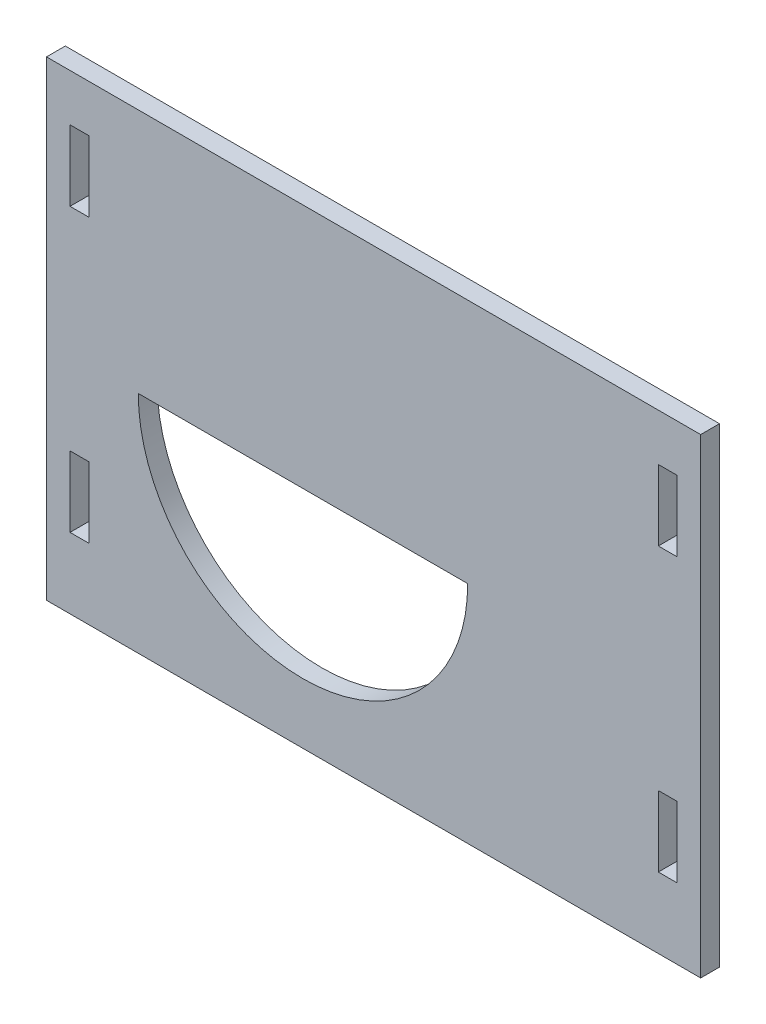
ISO-10303-21;
HEADER;
FILE_DESCRIPTION(('STEP AP214'),'2;1');
FILE_NAME('part.step','',(''),(''),'','','');
FILE_SCHEMA(('AUTOMOTIVE_DESIGN { 1 0 10303 214 1 1 1 1 }'));
ENDSEC;
DATA;
#1=APPLICATION_CONTEXT('core data for automotive mechanical design processes');
#2=APPLICATION_PROTOCOL_DEFINITION('international standard','automotive_design',2000,#1);
#3=PRODUCT_CONTEXT('',#1,'mechanical');
#4=PRODUCT('Part','Part','',(#3));
#5=PRODUCT_RELATED_PRODUCT_CATEGORY('part','',(#4));
#6=PRODUCT_DEFINITION_FORMATION('','',#4);
#7=PRODUCT_DEFINITION_CONTEXT('part definition',#1,'design');
#8=PRODUCT_DEFINITION('design','',#6,#7);
#9=PRODUCT_DEFINITION_SHAPE('','',#8);
#10=(LENGTH_UNIT() NAMED_UNIT(*) SI_UNIT(.MILLI.,.METRE.));
#11=(NAMED_UNIT(*) PLANE_ANGLE_UNIT() SI_UNIT($,.RADIAN.));
#12=(NAMED_UNIT(*) SI_UNIT($,.STERADIAN.) SOLID_ANGLE_UNIT());
#13=UNCERTAINTY_MEASURE_WITH_UNIT(LENGTH_MEASURE(1.E-05),#10,'distance_accuracy_value','');
#14=(GEOMETRIC_REPRESENTATION_CONTEXT(3) GLOBAL_UNCERTAINTY_ASSIGNED_CONTEXT((#13)) GLOBAL_UNIT_ASSIGNED_CONTEXT((#10,
#11,#12)) REPRESENTATION_CONTEXT('',''));
#15=CARTESIAN_POINT('',(0.,0.,0.));
#16=DIRECTION('',(0.,0.,1.));
#17=DIRECTION('',(1.,0.,0.));
#18=AXIS2_PLACEMENT_3D('',#15,#16,#17);
#19=CARTESIAN_POINT('',(0.,0.,4.));
#20=DIRECTION('',(0.,0.,-1.));
#21=DIRECTION('',(-1.,0.,0.));
#22=AXIS2_PLACEMENT_3D('',#19,#20,#21);
#23=PLANE('',#22);
#24=DIRECTION('',(0.,1.,0.));
#25=VECTOR('',#24,1.);
#26=CARTESIAN_POINT('',(79.5,37.5,4.));
#27=LINE('',#26,#25);
#28=CARTESIAN_POINT('',(79.5,22.5000000000001,4.));
#29=VERTEX_POINT('',#28);
#30=CARTESIAN_POINT('',(79.5,37.5,4.));
#31=VERTEX_POINT('',#30);
#32=EDGE_CURVE('E218',#29,#31,#27,.T.);
#33=ORIENTED_EDGE('',*,*,#32,.F.);
#34=DIRECTION('',(1.,0.,0.));
#35=VECTOR('',#34,1.);
#36=CARTESIAN_POINT('',(79.5,22.5000000000001,4.));
#37=LINE('',#36,#35);
#38=CARTESIAN_POINT('',(75.5,22.5000000000001,4.));
#39=VERTEX_POINT('',#38);
#40=EDGE_CURVE('E226',#39,#29,#37,.T.);
#41=ORIENTED_EDGE('',*,*,#40,.F.);
#42=DIRECTION('',(0.,-1.,0.));
#43=VECTOR('',#42,1.);
#44=CARTESIAN_POINT('',(75.5,37.5,4.));
#45=LINE('',#44,#43);
#46=CARTESIAN_POINT('',(75.5,37.5,4.));
#47=VERTEX_POINT('',#46);
#48=EDGE_CURVE('E223',#47,#39,#45,.T.);
#49=ORIENTED_EDGE('',*,*,#48,.F.);
#50=DIRECTION('',(-1.,0.,0.));
#51=VECTOR('',#50,1.);
#52=CARTESIAN_POINT('',(79.5,37.5,4.));
#53=LINE('',#52,#51);
#54=EDGE_CURVE('E220',#31,#47,#53,.T.);
#55=ORIENTED_EDGE('',*,*,#54,.F.);
#56=EDGE_LOOP('',(#33,#41,#49,#55));
#57=FACE_BOUND('',#56,.T.);
#58=DIRECTION('',(1.,0.,0.));
#59=VECTOR('',#58,1.);
#60=CARTESIAN_POINT('',(-45.5,-37.5,4.));
#61=LINE('',#60,#59);
#62=CARTESIAN_POINT('',(-49.5,-37.5,4.));
#63=VERTEX_POINT('',#62);
#64=CARTESIAN_POINT('',(-45.5,-37.5,4.));
#65=VERTEX_POINT('',#64);
#66=EDGE_CURVE('E280',#63,#65,#61,.T.);
#67=ORIENTED_EDGE('',*,*,#66,.F.);
#68=DIRECTION('',(0.,-1.,0.));
#69=VECTOR('',#68,1.);
#70=CARTESIAN_POINT('',(-49.5,-37.5,4.));
#71=LINE('',#70,#69);
#72=CARTESIAN_POINT('',(-49.5,-22.5000000000001,4.));
#73=VERTEX_POINT('',#72);
#74=EDGE_CURVE('E288',#73,#63,#71,.T.);
#75=ORIENTED_EDGE('',*,*,#74,.F.);
#76=DIRECTION('',(-1.,0.,0.));
#77=VECTOR('',#76,1.);
#78=CARTESIAN_POINT('',(-45.5,-22.5,4.));
#79=LINE('',#78,#77);
#80=CARTESIAN_POINT('',(-45.5,-22.5,4.));
#81=VERTEX_POINT('',#80);
#82=EDGE_CURVE('E285',#81,#73,#79,.T.);
#83=ORIENTED_EDGE('',*,*,#82,.F.);
#84=DIRECTION('',(0.,1.,0.));
#85=VECTOR('',#84,1.);
#86=CARTESIAN_POINT('',(-45.5,-37.5,4.));
#87=LINE('',#86,#85);
#88=EDGE_CURVE('E282',#65,#81,#87,.T.);
#89=ORIENTED_EDGE('',*,*,#88,.F.);
#90=EDGE_LOOP('',(#67,#75,#83,#89));
#91=FACE_BOUND('',#90,.T.);
#92=DIRECTION('',(-1.,0.,0.));
#93=VECTOR('',#92,1.);
#94=CARTESIAN_POINT('',(64.5,47.5,4.));
#95=LINE('',#94,#93);
#96=CARTESIAN_POINT('',(84.5,47.5,4.));
#97=VERTEX_POINT('',#96);
#98=CARTESIAN_POINT('',(-54.5,47.5,4.));
#99=VERTEX_POINT('',#98);
#100=EDGE_CURVE('E328',#97,#99,#95,.T.);
#101=ORIENTED_EDGE('',*,*,#100,.T.);
#102=DIRECTION('',(0.,-1.,0.));
#103=VECTOR('',#102,1.);
#104=CARTESIAN_POINT('',(-54.5,47.5,4.));
#105=LINE('',#104,#103);
#106=CARTESIAN_POINT('',(-54.5,-52.5,4.));
#107=VERTEX_POINT('',#106);
#108=EDGE_CURVE('E330',#99,#107,#105,.T.);
#109=ORIENTED_EDGE('',*,*,#108,.T.);
#110=DIRECTION('',(1.,0.,0.));
#111=VECTOR('',#110,1.);
#112=CARTESIAN_POINT('',(-54.5,-52.5,4.));
#113=LINE('',#112,#111);
#114=CARTESIAN_POINT('',(84.5,-52.5,4.));
#115=VERTEX_POINT('',#114);
#116=EDGE_CURVE('E333',#107,#115,#113,.T.);
#117=ORIENTED_EDGE('',*,*,#116,.T.);
#118=DIRECTION('',(0.,1.,0.));
#119=VECTOR('',#118,1.);
#120=CARTESIAN_POINT('',(84.5,47.5,4.));
#121=LINE('',#120,#119);
#122=EDGE_CURVE('E335',#115,#97,#121,.T.);
#123=ORIENTED_EDGE('',*,*,#122,.T.);
#124=EDGE_LOOP('',(#101,#109,#117,#123));
#125=FACE_BOUND('',#124,.T.);
#126=CARTESIAN_POINT('',(0.,-4.67863448770159,4.));
#127=DIRECTION('',(0.,0.,1.));
#128=DIRECTION('',(1.,0.,0.));
#129=AXIS2_PLACEMENT_3D('',#126,#127,#128);
#130=CIRCLE('',#129,35.);
#131=CARTESIAN_POINT('',(-35.,-4.67863448770159,4.));
#132=VERTEX_POINT('',#131);
#133=CARTESIAN_POINT('',(35.,-4.67863448770159,4.));
#134=VERTEX_POINT('',#133);
#135=EDGE_CURVE('E311',#132,#134,#130,.T.);
#136=ORIENTED_EDGE('',*,*,#135,.F.);
#137=DIRECTION('',(-1.,0.,0.));
#138=VECTOR('',#137,1.);
#139=CARTESIAN_POINT('',(-35.,-4.67863448770159,4.));
#140=LINE('',#139,#138);
#141=EDGE_CURVE('E314',#134,#132,#140,.T.);
#142=ORIENTED_EDGE('',*,*,#141,.F.);
#143=EDGE_LOOP('',(#136,#142));
#144=FACE_BOUND('',#143,.T.);
#145=DIRECTION('',(0.,1.,0.));
#146=VECTOR('',#145,1.);
#147=CARTESIAN_POINT('',(-45.5,37.5,4.));
#148=LINE('',#147,#146);
#149=CARTESIAN_POINT('',(-45.5,22.5,4.));
#150=VERTEX_POINT('',#149);
#151=CARTESIAN_POINT('',(-45.5,37.5,4.));
#152=VERTEX_POINT('',#151);
#153=EDGE_CURVE('E249',#150,#152,#148,.T.);
#154=ORIENTED_EDGE('',*,*,#153,.F.);
#155=DIRECTION('',(1.,0.,0.));
#156=VECTOR('',#155,1.);
#157=CARTESIAN_POINT('',(-45.5,22.5,4.));
#158=LINE('',#157,#156);
#159=CARTESIAN_POINT('',(-49.5,22.5000000000001,4.));
#160=VERTEX_POINT('',#159);
#161=EDGE_CURVE('E257',#160,#150,#158,.T.);
#162=ORIENTED_EDGE('',*,*,#161,.F.);
#163=DIRECTION('',(0.,-1.,0.));
#164=VECTOR('',#163,1.);
#165=CARTESIAN_POINT('',(-49.5,37.5,4.));
#166=LINE('',#165,#164);
#167=CARTESIAN_POINT('',(-49.5,37.5,4.));
#168=VERTEX_POINT('',#167);
#169=EDGE_CURVE('E254',#168,#160,#166,.T.);
#170=ORIENTED_EDGE('',*,*,#169,.F.);
#171=DIRECTION('',(-1.,0.,0.));
#172=VECTOR('',#171,1.);
#173=CARTESIAN_POINT('',(-45.5,37.5,4.));
#174=LINE('',#173,#172);
#175=EDGE_CURVE('E251',#152,#168,#174,.T.);
#176=ORIENTED_EDGE('',*,*,#175,.F.);
#177=EDGE_LOOP('',(#154,#162,#170,#176));
#178=FACE_BOUND('',#177,.T.);
#179=DIRECTION('',(0.,1.,0.));
#180=VECTOR('',#179,1.);
#181=CARTESIAN_POINT('',(79.5,-22.5000000000001,4.));
#182=LINE('',#181,#180);
#183=CARTESIAN_POINT('',(79.5,-37.5,4.));
#184=VERTEX_POINT('',#183);
#185=CARTESIAN_POINT('',(79.5,-22.5000000000001,4.));
#186=VERTEX_POINT('',#185);
#187=EDGE_CURVE('E182',#184,#186,#182,.T.);
#188=ORIENTED_EDGE('',*,*,#187,.F.);
#189=DIRECTION('',(1.,0.,0.));
#190=VECTOR('',#189,1.);
#191=CARTESIAN_POINT('',(79.5,-37.5,4.));
#192=LINE('',#191,#190);
#193=CARTESIAN_POINT('',(75.5,-37.5,4.));
#194=VERTEX_POINT('',#193);
#195=EDGE_CURVE('E204',#194,#184,#192,.T.);
#196=ORIENTED_EDGE('',*,*,#195,.F.);
#197=DIRECTION('',(0.,-1.,0.));
#198=VECTOR('',#197,1.);
#199=CARTESIAN_POINT('',(75.5,-22.5000000000001,4.));
#200=LINE('',#199,#198);
#201=CARTESIAN_POINT('',(75.5,-22.5000000000001,4.));
#202=VERTEX_POINT('',#201);
#203=EDGE_CURVE('E202',#202,#194,#200,.T.);
#204=ORIENTED_EDGE('',*,*,#203,.F.);
#205=DIRECTION('',(-1.,0.,0.));
#206=VECTOR('',#205,1.);
#207=CARTESIAN_POINT('',(79.5,-22.5000000000001,4.));
#208=LINE('',#207,#206);
#209=EDGE_CURVE('E190',#186,#202,#208,.T.);
#210=ORIENTED_EDGE('',*,*,#209,.F.);
#211=EDGE_LOOP('',(#188,#196,#204,#210));
#212=FACE_BOUND('',#211,.T.);
#213=ADVANCED_FACE('F33',(#57,#91,#125,#144,#178,#212),#23,.F.);
#214=CARTESIAN_POINT('',(0.,0.,0.));
#215=DIRECTION('',(0.,0.,-1.));
#216=DIRECTION('',(-1.,0.,0.));
#217=AXIS2_PLACEMENT_3D('',#214,#215,#216);
#218=PLANE('',#217);
#219=DIRECTION('',(-1.,0.,0.));
#220=VECTOR('',#219,1.);
#221=CARTESIAN_POINT('',(-54.5,47.5,0.));
#222=LINE('',#221,#220);
#223=CARTESIAN_POINT('',(84.5,47.5,0.));
#224=VERTEX_POINT('',#223);
#225=CARTESIAN_POINT('',(-54.5,47.5,0.));
#226=VERTEX_POINT('',#225);
#227=EDGE_CURVE('E327',#224,#226,#222,.T.);
#228=ORIENTED_EDGE('',*,*,#227,.F.);
#229=DIRECTION('',(0.,1.,0.));
#230=VECTOR('',#229,1.);
#231=CARTESIAN_POINT('',(84.5,47.5,0.));
#232=LINE('',#231,#230);
#233=CARTESIAN_POINT('',(84.5,-52.5,0.));
#234=VERTEX_POINT('',#233);
#235=EDGE_CURVE('E331',#234,#224,#232,.T.);
#236=ORIENTED_EDGE('',*,*,#235,.F.);
#237=DIRECTION('',(1.,0.,0.));
#238=VECTOR('',#237,1.);
#239=CARTESIAN_POINT('',(84.5,-52.5,0.));
#240=LINE('',#239,#238);
#241=CARTESIAN_POINT('',(-54.5,-52.5,0.));
#242=VERTEX_POINT('',#241);
#243=EDGE_CURVE('E342',#242,#234,#240,.T.);
#244=ORIENTED_EDGE('',*,*,#243,.F.);
#245=DIRECTION('',(0.,-1.,0.));
#246=VECTOR('',#245,1.);
#247=CARTESIAN_POINT('',(-54.5,47.5,0.));
#248=LINE('',#247,#246);
#249=EDGE_CURVE('E339',#226,#242,#248,.T.);
#250=ORIENTED_EDGE('',*,*,#249,.F.);
#251=EDGE_LOOP('',(#228,#236,#244,#250));
#252=FACE_BOUND('',#251,.T.);
#253=DIRECTION('',(-1.,0.,0.));
#254=VECTOR('',#253,1.);
#255=CARTESIAN_POINT('',(-35.,-4.67863448770159,0.));
#256=LINE('',#255,#254);
#257=CARTESIAN_POINT('',(35.,-4.67863448770159,0.));
#258=VERTEX_POINT('',#257);
#259=CARTESIAN_POINT('',(-35.,-4.67863448770159,0.));
#260=VERTEX_POINT('',#259);
#261=EDGE_CURVE('E315',#258,#260,#256,.T.);
#262=ORIENTED_EDGE('',*,*,#261,.T.);
#263=CARTESIAN_POINT('',(0.,-4.67863448770159,0.));
#264=DIRECTION('',(0.,0.,1.));
#265=DIRECTION('',(1.,0.,0.));
#266=AXIS2_PLACEMENT_3D('',#263,#264,#265);
#267=CIRCLE('',#266,35.);
#268=EDGE_CURVE('E310',#260,#258,#267,.T.);
#269=ORIENTED_EDGE('',*,*,#268,.T.);
#270=EDGE_LOOP('',(#262,#269));
#271=FACE_BOUND('',#270,.T.);
#272=DIRECTION('',(0.,-1.,0.));
#273=VECTOR('',#272,1.);
#274=CARTESIAN_POINT('',(-49.5,-37.5,0.));
#275=LINE('',#274,#273);
#276=CARTESIAN_POINT('',(-49.5,-22.5000000000001,0.));
#277=VERTEX_POINT('',#276);
#278=CARTESIAN_POINT('',(-49.5,-37.5,0.));
#279=VERTEX_POINT('',#278);
#280=EDGE_CURVE('E283',#277,#279,#275,.T.);
#281=ORIENTED_EDGE('',*,*,#280,.T.);
#282=DIRECTION('',(1.,0.,0.));
#283=VECTOR('',#282,1.);
#284=CARTESIAN_POINT('',(-45.5,-37.5,0.));
#285=LINE('',#284,#283);
#286=CARTESIAN_POINT('',(-45.5,-37.5,0.));
#287=VERTEX_POINT('',#286);
#288=EDGE_CURVE('E279',#279,#287,#285,.T.);
#289=ORIENTED_EDGE('',*,*,#288,.T.);
#290=DIRECTION('',(0.,1.,0.));
#291=VECTOR('',#290,1.);
#292=CARTESIAN_POINT('',(-45.5,-37.5,0.));
#293=LINE('',#292,#291);
#294=CARTESIAN_POINT('',(-45.5,-22.5,0.));
#295=VERTEX_POINT('',#294);
#296=EDGE_CURVE('E293',#287,#295,#293,.T.);
#297=ORIENTED_EDGE('',*,*,#296,.T.);
#298=DIRECTION('',(-1.,0.,0.));
#299=VECTOR('',#298,1.);
#300=CARTESIAN_POINT('',(-45.5,-22.5,0.));
#301=LINE('',#300,#299);
#302=EDGE_CURVE('E296',#295,#277,#301,.T.);
#303=ORIENTED_EDGE('',*,*,#302,.T.);
#304=EDGE_LOOP('',(#281,#289,#297,#303));
#305=FACE_BOUND('',#304,.T.);
#306=DIRECTION('',(1.,0.,0.));
#307=VECTOR('',#306,1.);
#308=CARTESIAN_POINT('',(-45.5,22.5,0.));
#309=LINE('',#308,#307);
#310=CARTESIAN_POINT('',(-49.5,22.5000000000001,0.));
#311=VERTEX_POINT('',#310);
#312=CARTESIAN_POINT('',(-45.5,22.5,0.));
#313=VERTEX_POINT('',#312);
#314=EDGE_CURVE('E252',#311,#313,#309,.T.);
#315=ORIENTED_EDGE('',*,*,#314,.T.);
#316=DIRECTION('',(0.,1.,0.));
#317=VECTOR('',#316,1.);
#318=CARTESIAN_POINT('',(-45.5,37.5,0.));
#319=LINE('',#318,#317);
#320=CARTESIAN_POINT('',(-45.5,37.5,0.));
#321=VERTEX_POINT('',#320);
#322=EDGE_CURVE('E248',#313,#321,#319,.T.);
#323=ORIENTED_EDGE('',*,*,#322,.T.);
#324=DIRECTION('',(-1.,0.,0.));
#325=VECTOR('',#324,1.);
#326=CARTESIAN_POINT('',(-45.5,37.5,0.));
#327=LINE('',#326,#325);
#328=CARTESIAN_POINT('',(-49.5,37.5,0.));
#329=VERTEX_POINT('',#328);
#330=EDGE_CURVE('E262',#321,#329,#327,.T.);
#331=ORIENTED_EDGE('',*,*,#330,.T.);
#332=DIRECTION('',(0.,-1.,0.));
#333=VECTOR('',#332,1.);
#334=CARTESIAN_POINT('',(-49.5,37.5,0.));
#335=LINE('',#334,#333);
#336=EDGE_CURVE('E265',#329,#311,#335,.T.);
#337=ORIENTED_EDGE('',*,*,#336,.T.);
#338=EDGE_LOOP('',(#315,#323,#331,#337));
#339=FACE_BOUND('',#338,.T.);
#340=DIRECTION('',(1.,0.,0.));
#341=VECTOR('',#340,1.);
#342=CARTESIAN_POINT('',(79.5,22.5000000000001,0.));
#343=LINE('',#342,#341);
#344=CARTESIAN_POINT('',(75.5,22.5000000000001,0.));
#345=VERTEX_POINT('',#344);
#346=CARTESIAN_POINT('',(79.5,22.5000000000001,0.));
#347=VERTEX_POINT('',#346);
#348=EDGE_CURVE('E221',#345,#347,#343,.T.);
#349=ORIENTED_EDGE('',*,*,#348,.T.);
#350=DIRECTION('',(0.,1.,0.));
#351=VECTOR('',#350,1.);
#352=CARTESIAN_POINT('',(79.5,37.5,0.));
#353=LINE('',#352,#351);
#354=CARTESIAN_POINT('',(79.5,37.5,0.));
#355=VERTEX_POINT('',#354);
#356=EDGE_CURVE('E198',#347,#355,#353,.T.);
#357=ORIENTED_EDGE('',*,*,#356,.T.);
#358=DIRECTION('',(-1.,0.,0.));
#359=VECTOR('',#358,1.);
#360=CARTESIAN_POINT('',(79.5,37.5,0.));
#361=LINE('',#360,#359);
#362=CARTESIAN_POINT('',(75.5,37.5,0.));
#363=VERTEX_POINT('',#362);
#364=EDGE_CURVE('E231',#355,#363,#361,.T.);
#365=ORIENTED_EDGE('',*,*,#364,.T.);
#366=DIRECTION('',(0.,-1.,0.));
#367=VECTOR('',#366,1.);
#368=CARTESIAN_POINT('',(75.5,37.5,0.));
#369=LINE('',#368,#367);
#370=EDGE_CURVE('E234',#363,#345,#369,.T.);
#371=ORIENTED_EDGE('',*,*,#370,.T.);
#372=EDGE_LOOP('',(#349,#357,#365,#371));
#373=FACE_BOUND('',#372,.T.);
#374=DIRECTION('',(1.,0.,0.));
#375=VECTOR('',#374,1.);
#376=CARTESIAN_POINT('',(79.5,-37.5,0.));
#377=LINE('',#376,#375);
#378=CARTESIAN_POINT('',(75.5,-37.5,0.));
#379=VERTEX_POINT('',#378);
#380=CARTESIAN_POINT('',(79.5,-37.5,0.));
#381=VERTEX_POINT('',#380);
#382=EDGE_CURVE('E191',#379,#381,#377,.T.);
#383=ORIENTED_EDGE('',*,*,#382,.T.);
#384=DIRECTION('',(0.,1.,0.));
#385=VECTOR('',#384,1.);
#386=CARTESIAN_POINT('',(79.5,-22.5000000000001,0.));
#387=LINE('',#386,#385);
#388=CARTESIAN_POINT('',(79.5,-22.5000000000001,0.));
#389=VERTEX_POINT('',#388);
#390=EDGE_CURVE('E56',#381,#389,#387,.T.);
#391=ORIENTED_EDGE('',*,*,#390,.T.);
#392=DIRECTION('',(-1.,0.,0.));
#393=VECTOR('',#392,1.);
#394=CARTESIAN_POINT('',(79.5,-22.5000000000001,0.));
#395=LINE('',#394,#393);
#396=CARTESIAN_POINT('',(75.5,-22.5000000000001,0.));
#397=VERTEX_POINT('',#396);
#398=EDGE_CURVE('E197',#389,#397,#395,.T.);
#399=ORIENTED_EDGE('',*,*,#398,.T.);
#400=DIRECTION('',(0.,-1.,0.));
#401=VECTOR('',#400,1.);
#402=CARTESIAN_POINT('',(75.5,-22.5000000000001,0.));
#403=LINE('',#402,#401);
#404=EDGE_CURVE('E210',#397,#379,#403,.T.);
#405=ORIENTED_EDGE('',*,*,#404,.T.);
#406=EDGE_LOOP('',(#383,#391,#399,#405));
#407=FACE_BOUND('',#406,.T.);
#408=ADVANCED_FACE('F362',(#252,#271,#305,#339,#373,#407),#218,.T.);
#409=CARTESIAN_POINT('',(-54.5,47.5,4.));
#410=DIRECTION('',(0.,-1.,0.));
#411=DIRECTION('',(1.,0.,0.));
#412=AXIS2_PLACEMENT_3D('',#409,#410,#411);
#413=PLANE('',#412);
#414=ORIENTED_EDGE('',*,*,#227,.T.);
#415=DIRECTION('',(0.,0.,-1.));
#416=VECTOR('',#415,1.);
#417=CARTESIAN_POINT('',(-54.5,47.5,4.));
#418=LINE('',#417,#416);
#419=EDGE_CURVE('E11',#99,#226,#418,.T.);
#420=ORIENTED_EDGE('',*,*,#419,.F.);
#421=ORIENTED_EDGE('',*,*,#100,.F.);
#422=DIRECTION('',(0.,0.,-1.));
#423=VECTOR('',#422,1.);
#424=CARTESIAN_POINT('',(84.5,47.5,4.));
#425=LINE('',#424,#423);
#426=EDGE_CURVE('E337',#97,#224,#425,.T.);
#427=ORIENTED_EDGE('',*,*,#426,.T.);
#428=EDGE_LOOP('',(#414,#420,#421,#427));
#429=FACE_BOUND('',#428,.T.);
#430=ADVANCED_FACE('F35',(#429),#413,.F.);
#431=CARTESIAN_POINT('',(-54.5,47.5,4.));
#432=DIRECTION('',(1.,0.,0.));
#433=DIRECTION('',(0.,0.,-1.));
#434=AXIS2_PLACEMENT_3D('',#431,#432,#433);
#435=PLANE('',#434);
#436=ORIENTED_EDGE('',*,*,#249,.T.);
#437=DIRECTION('',(0.,0.,-1.));
#438=VECTOR('',#437,1.);
#439=CARTESIAN_POINT('',(-54.5,-52.5,4.));
#440=LINE('',#439,#438);
#441=EDGE_CURVE('E41',#107,#242,#440,.T.);
#442=ORIENTED_EDGE('',*,*,#441,.F.);
#443=ORIENTED_EDGE('',*,*,#108,.F.);
#444=ORIENTED_EDGE('',*,*,#419,.T.);
#445=EDGE_LOOP('',(#436,#442,#443,#444));
#446=FACE_BOUND('',#445,.T.);
#447=ADVANCED_FACE('F358',(#446),#435,.F.);
#448=CARTESIAN_POINT('',(84.5,-52.5,4.));
#449=DIRECTION('',(0.,1.,0.));
#450=DIRECTION('',(0.,0.,1.));
#451=AXIS2_PLACEMENT_3D('',#448,#449,#450);
#452=PLANE('',#451);
#453=ORIENTED_EDGE('',*,*,#243,.T.);
#454=DIRECTION('',(0.,0.,-1.));
#455=VECTOR('',#454,1.);
#456=CARTESIAN_POINT('',(84.5,-52.5,4.));
#457=LINE('',#456,#455);
#458=EDGE_CURVE('E348',#115,#234,#457,.T.);
#459=ORIENTED_EDGE('',*,*,#458,.F.);
#460=ORIENTED_EDGE('',*,*,#116,.F.);
#461=ORIENTED_EDGE('',*,*,#441,.T.);
#462=EDGE_LOOP('',(#453,#459,#460,#461));
#463=FACE_BOUND('',#462,.T.);
#464=ADVANCED_FACE('F354',(#463),#452,.F.);
#465=CARTESIAN_POINT('',(84.5,47.5,4.));
#466=DIRECTION('',(-1.,0.,0.));
#467=DIRECTION('',(0.,0.,1.));
#468=AXIS2_PLACEMENT_3D('',#465,#466,#467);
#469=PLANE('',#468);
#470=ORIENTED_EDGE('',*,*,#235,.T.);
#471=ORIENTED_EDGE('',*,*,#426,.F.);
#472=ORIENTED_EDGE('',*,*,#122,.F.);
#473=ORIENTED_EDGE('',*,*,#458,.T.);
#474=EDGE_LOOP('',(#470,#471,#472,#473));
#475=FACE_BOUND('',#474,.T.);
#476=ADVANCED_FACE('F367',(#475),#469,.F.);
#477=CARTESIAN_POINT('',(0.,-4.67863448770159,4.));
#478=DIRECTION('',(0.,0.,-1.));
#479=DIRECTION('',(-1.,0.,0.));
#480=AXIS2_PLACEMENT_3D('',#477,#478,#479);
#481=CYLINDRICAL_SURFACE('',#480,35.);
#482=ORIENTED_EDGE('',*,*,#268,.F.);
#483=DIRECTION('',(0.,0.,-1.));
#484=VECTOR('',#483,1.);
#485=CARTESIAN_POINT('',(-35.,-4.67863448770159,4.));
#486=LINE('',#485,#484);
#487=EDGE_CURVE('E317',#132,#260,#486,.T.);
#488=ORIENTED_EDGE('',*,*,#487,.F.);
#489=ORIENTED_EDGE('',*,*,#135,.T.);
#490=DIRECTION('',(0.,0.,-1.));
#491=VECTOR('',#490,1.);
#492=CARTESIAN_POINT('',(35.,-4.67863448770159,4.));
#493=LINE('',#492,#491);
#494=EDGE_CURVE('E324',#134,#258,#493,.T.);
#495=ORIENTED_EDGE('',*,*,#494,.T.);
#496=EDGE_LOOP('',(#482,#488,#489,#495));
#497=FACE_BOUND('',#496,.T.);
#498=ADVANCED_FACE('F430',(#497),#481,.F.);
#499=CARTESIAN_POINT('',(-35.,-4.67863448770159,4.));
#500=DIRECTION('',(0.,-1.,0.));
#501=DIRECTION('',(0.,0.,-1.));
#502=AXIS2_PLACEMENT_3D('',#499,#500,#501);
#503=PLANE('',#502);
#504=ORIENTED_EDGE('',*,*,#261,.F.);
#505=ORIENTED_EDGE('',*,*,#494,.F.);
#506=ORIENTED_EDGE('',*,*,#141,.T.);
#507=ORIENTED_EDGE('',*,*,#487,.T.);
#508=EDGE_LOOP('',(#504,#505,#506,#507));
#509=FACE_BOUND('',#508,.T.);
#510=ADVANCED_FACE('F426',(#509),#503,.T.);
#511=CARTESIAN_POINT('',(-45.5,-37.5,4.));
#512=DIRECTION('',(0.,1.,0.));
#513=DIRECTION('',(0.,0.,1.));
#514=AXIS2_PLACEMENT_3D('',#511,#512,#513);
#515=PLANE('',#514);
#516=ORIENTED_EDGE('',*,*,#288,.F.);
#517=DIRECTION('',(0.,0.,-1.));
#518=VECTOR('',#517,1.);
#519=CARTESIAN_POINT('',(-49.5,-37.5,4.));
#520=LINE('',#519,#518);
#521=EDGE_CURVE('E290',#63,#279,#520,.T.);
#522=ORIENTED_EDGE('',*,*,#521,.F.);
#523=ORIENTED_EDGE('',*,*,#66,.T.);
#524=DIRECTION('',(0.,0.,-1.));
#525=VECTOR('',#524,1.);
#526=CARTESIAN_POINT('',(-45.5,-37.5,4.));
#527=LINE('',#526,#525);
#528=EDGE_CURVE('E307',#65,#287,#527,.T.);
#529=ORIENTED_EDGE('',*,*,#528,.T.);
#530=EDGE_LOOP('',(#516,#522,#523,#529));
#531=FACE_BOUND('',#530,.T.);
#532=ADVANCED_FACE('F422',(#531),#515,.T.);
#533=CARTESIAN_POINT('',(-45.5,-37.5,4.));
#534=DIRECTION('',(-1.,0.,0.));
#535=DIRECTION('',(0.,0.,1.));
#536=AXIS2_PLACEMENT_3D('',#533,#534,#535);
#537=PLANE('',#536);
#538=ORIENTED_EDGE('',*,*,#296,.F.);
#539=ORIENTED_EDGE('',*,*,#528,.F.);
#540=ORIENTED_EDGE('',*,*,#88,.T.);
#541=DIRECTION('',(0.,0.,-1.));
#542=VECTOR('',#541,1.);
#543=CARTESIAN_POINT('',(-45.5,-22.5,4.));
#544=LINE('',#543,#542);
#545=EDGE_CURVE('E305',#81,#295,#544,.T.);
#546=ORIENTED_EDGE('',*,*,#545,.T.);
#547=EDGE_LOOP('',(#538,#539,#540,#546));
#548=FACE_BOUND('',#547,.T.);
#549=ADVANCED_FACE('F418',(#548),#537,.T.);
#550=CARTESIAN_POINT('',(-45.5,-22.5,4.));
#551=DIRECTION('',(0.,-1.,0.));
#552=DIRECTION('',(1.,0.,0.));
#553=AXIS2_PLACEMENT_3D('',#550,#551,#552);
#554=PLANE('',#553);
#555=ORIENTED_EDGE('',*,*,#302,.F.);
#556=ORIENTED_EDGE('',*,*,#545,.F.);
#557=ORIENTED_EDGE('',*,*,#82,.T.);
#558=DIRECTION('',(0.,0.,-1.));
#559=VECTOR('',#558,1.);
#560=CARTESIAN_POINT('',(-49.5,-22.5000000000001,4.));
#561=LINE('',#560,#559);
#562=EDGE_CURVE('E303',#73,#277,#561,.T.);
#563=ORIENTED_EDGE('',*,*,#562,.T.);
#564=EDGE_LOOP('',(#555,#556,#557,#563));
#565=FACE_BOUND('',#564,.T.);
#566=ADVANCED_FACE('F414',(#565),#554,.T.);
#567=CARTESIAN_POINT('',(-49.5,-37.5,4.));
#568=DIRECTION('',(1.,0.,0.));
#569=DIRECTION('',(0.,0.,-1.));
#570=AXIS2_PLACEMENT_3D('',#567,#568,#569);
#571=PLANE('',#570);
#572=ORIENTED_EDGE('',*,*,#280,.F.);
#573=ORIENTED_EDGE('',*,*,#562,.F.);
#574=ORIENTED_EDGE('',*,*,#74,.T.);
#575=ORIENTED_EDGE('',*,*,#521,.T.);
#576=EDGE_LOOP('',(#572,#573,#574,#575));
#577=FACE_BOUND('',#576,.T.);
#578=ADVANCED_FACE('F411',(#577),#571,.T.);
#579=CARTESIAN_POINT('',(-45.5,37.5,4.));
#580=DIRECTION('',(-1.,0.,0.));
#581=DIRECTION('',(0.,0.,1.));
#582=AXIS2_PLACEMENT_3D('',#579,#580,#581);
#583=PLANE('',#582);
#584=ORIENTED_EDGE('',*,*,#322,.F.);
#585=DIRECTION('',(0.,0.,-1.));
#586=VECTOR('',#585,1.);
#587=CARTESIAN_POINT('',(-45.5,22.5,4.));
#588=LINE('',#587,#586);
#589=EDGE_CURVE('E259',#150,#313,#588,.T.);
#590=ORIENTED_EDGE('',*,*,#589,.F.);
#591=ORIENTED_EDGE('',*,*,#153,.T.);
#592=DIRECTION('',(0.,0.,-1.));
#593=VECTOR('',#592,1.);
#594=CARTESIAN_POINT('',(-45.5,37.5,4.));
#595=LINE('',#594,#593);
#596=EDGE_CURVE('E276',#152,#321,#595,.T.);
#597=ORIENTED_EDGE('',*,*,#596,.T.);
#598=EDGE_LOOP('',(#584,#590,#591,#597));
#599=FACE_BOUND('',#598,.T.);
#600=ADVANCED_FACE('F386',(#599),#583,.T.);
#601=CARTESIAN_POINT('',(-45.5,37.5,4.));
#602=DIRECTION('',(0.,-1.,0.));
#603=DIRECTION('',(1.,0.,0.));
#604=AXIS2_PLACEMENT_3D('',#601,#602,#603);
#605=PLANE('',#604);
#606=ORIENTED_EDGE('',*,*,#330,.F.);
#607=ORIENTED_EDGE('',*,*,#596,.F.);
#608=ORIENTED_EDGE('',*,*,#175,.T.);
#609=DIRECTION('',(0.,0.,-1.));
#610=VECTOR('',#609,1.);
#611=CARTESIAN_POINT('',(-49.5,37.5,4.));
#612=LINE('',#611,#610);
#613=EDGE_CURVE('E274',#168,#329,#612,.T.);
#614=ORIENTED_EDGE('',*,*,#613,.T.);
#615=EDGE_LOOP('',(#606,#607,#608,#614));
#616=FACE_BOUND('',#615,.T.);
#617=ADVANCED_FACE('F388',(#616),#605,.T.);
#618=CARTESIAN_POINT('',(-49.5,37.5,4.));
#619=DIRECTION('',(1.,0.,0.));
#620=DIRECTION('',(0.,0.,-1.));
#621=AXIS2_PLACEMENT_3D('',#618,#619,#620);
#622=PLANE('',#621);
#623=ORIENTED_EDGE('',*,*,#336,.F.);
#624=ORIENTED_EDGE('',*,*,#613,.F.);
#625=ORIENTED_EDGE('',*,*,#169,.T.);
#626=DIRECTION('',(0.,0.,-1.));
#627=VECTOR('',#626,1.);
#628=CARTESIAN_POINT('',(-49.5,22.5000000000001,4.));
#629=LINE('',#628,#627);
#630=EDGE_CURVE('E272',#160,#311,#629,.T.);
#631=ORIENTED_EDGE('',*,*,#630,.T.);
#632=EDGE_LOOP('',(#623,#624,#625,#631));
#633=FACE_BOUND('',#632,.T.);
#634=ADVANCED_FACE('F397',(#633),#622,.T.);
#635=CARTESIAN_POINT('',(-45.5,22.5,4.));
#636=DIRECTION('',(0.,1.,0.));
#637=DIRECTION('',(-1.,0.,0.));
#638=AXIS2_PLACEMENT_3D('',#635,#636,#637);
#639=PLANE('',#638);
#640=ORIENTED_EDGE('',*,*,#314,.F.);
#641=ORIENTED_EDGE('',*,*,#630,.F.);
#642=ORIENTED_EDGE('',*,*,#161,.T.);
#643=ORIENTED_EDGE('',*,*,#589,.T.);
#644=EDGE_LOOP('',(#640,#641,#642,#643));
#645=FACE_BOUND('',#644,.T.);
#646=ADVANCED_FACE('F395',(#645),#639,.T.);
#647=CARTESIAN_POINT('',(79.5,37.5,4.));
#648=DIRECTION('',(-1.,0.,0.));
#649=DIRECTION('',(0.,0.,1.));
#650=AXIS2_PLACEMENT_3D('',#647,#648,#649);
#651=PLANE('',#650);
#652=ORIENTED_EDGE('',*,*,#356,.F.);
#653=DIRECTION('',(0.,0.,-1.));
#654=VECTOR('',#653,1.);
#655=CARTESIAN_POINT('',(79.5,22.5000000000001,4.));
#656=LINE('',#655,#654);
#657=EDGE_CURVE('E228',#29,#347,#656,.T.);
#658=ORIENTED_EDGE('',*,*,#657,.F.);
#659=ORIENTED_EDGE('',*,*,#32,.T.);
#660=DIRECTION('',(0.,0.,-1.));
#661=VECTOR('',#660,1.);
#662=CARTESIAN_POINT('',(79.5,37.5,4.));
#663=LINE('',#662,#661);
#664=EDGE_CURVE('E245',#31,#355,#663,.T.);
#665=ORIENTED_EDGE('',*,*,#664,.T.);
#666=EDGE_LOOP('',(#652,#658,#659,#665));
#667=FACE_BOUND('',#666,.T.);
#668=ADVANCED_FACE('F404',(#667),#651,.T.);
#669=CARTESIAN_POINT('',(79.5,37.5,4.));
#670=DIRECTION('',(0.,-1.,0.));
#671=DIRECTION('',(0.,0.,-1.));
#672=AXIS2_PLACEMENT_3D('',#669,#670,#671);
#673=PLANE('',#672);
#674=ORIENTED_EDGE('',*,*,#364,.F.);
#675=ORIENTED_EDGE('',*,*,#664,.F.);
#676=ORIENTED_EDGE('',*,*,#54,.T.);
#677=DIRECTION('',(0.,0.,-1.));
#678=VECTOR('',#677,1.);
#679=CARTESIAN_POINT('',(75.5,37.5,4.));
#680=LINE('',#679,#678);
#681=EDGE_CURVE('E243',#47,#363,#680,.T.);
#682=ORIENTED_EDGE('',*,*,#681,.T.);
#683=EDGE_LOOP('',(#674,#675,#676,#682));
#684=FACE_BOUND('',#683,.T.);
#685=ADVANCED_FACE('F537',(#684),#673,.T.);
#686=CARTESIAN_POINT('',(75.5,37.5,4.));
#687=DIRECTION('',(1.,0.,0.));
#688=DIRECTION('',(0.,0.,-1.));
#689=AXIS2_PLACEMENT_3D('',#686,#687,#688);
#690=PLANE('',#689);
#691=ORIENTED_EDGE('',*,*,#370,.F.);
#692=ORIENTED_EDGE('',*,*,#681,.F.);
#693=ORIENTED_EDGE('',*,*,#48,.T.);
#694=DIRECTION('',(0.,0.,-1.));
#695=VECTOR('',#694,1.);
#696=CARTESIAN_POINT('',(75.5,22.5000000000001,4.));
#697=LINE('',#696,#695);
#698=EDGE_CURVE('E241',#39,#345,#697,.T.);
#699=ORIENTED_EDGE('',*,*,#698,.T.);
#700=EDGE_LOOP('',(#691,#692,#693,#699));
#701=FACE_BOUND('',#700,.T.);
#702=ADVANCED_FACE('F545',(#701),#690,.T.);
#703=CARTESIAN_POINT('',(79.5,22.5000000000001,4.));
#704=DIRECTION('',(0.,1.,0.));
#705=DIRECTION('',(0.,0.,1.));
#706=AXIS2_PLACEMENT_3D('',#703,#704,#705);
#707=PLANE('',#706);
#708=ORIENTED_EDGE('',*,*,#348,.F.);
#709=ORIENTED_EDGE('',*,*,#698,.F.);
#710=ORIENTED_EDGE('',*,*,#40,.T.);
#711=ORIENTED_EDGE('',*,*,#657,.T.);
#712=EDGE_LOOP('',(#708,#709,#710,#711));
#713=FACE_BOUND('',#712,.T.);
#714=ADVANCED_FACE('F554',(#713),#707,.T.);
#715=CARTESIAN_POINT('',(79.5,-22.5000000000001,4.));
#716=DIRECTION('',(-1.,0.,0.));
#717=DIRECTION('',(0.,0.,1.));
#718=AXIS2_PLACEMENT_3D('',#715,#716,#717);
#719=PLANE('',#718);
#720=ORIENTED_EDGE('',*,*,#390,.F.);
#721=DIRECTION('',(0.,0.,-1.));
#722=VECTOR('',#721,1.);
#723=CARTESIAN_POINT('',(79.5,-37.5,4.));
#724=LINE('',#723,#722);
#725=EDGE_CURVE('E186',#184,#381,#724,.T.);
#726=ORIENTED_EDGE('',*,*,#725,.F.);
#727=ORIENTED_EDGE('',*,*,#187,.T.);
#728=DIRECTION('',(0.,0.,-1.));
#729=VECTOR('',#728,1.);
#730=CARTESIAN_POINT('',(79.5,-22.5000000000001,4.));
#731=LINE('',#730,#729);
#732=EDGE_CURVE('E185',#186,#389,#731,.T.);
#733=ORIENTED_EDGE('',*,*,#732,.T.);
#734=EDGE_LOOP('',(#720,#726,#727,#733));
#735=FACE_BOUND('',#734,.T.);
#736=ADVANCED_FACE('F184',(#735),#719,.T.);
#737=CARTESIAN_POINT('',(79.5,-22.5000000000001,4.));
#738=DIRECTION('',(0.,-1.,0.));
#739=DIRECTION('',(1.,0.,0.));
#740=AXIS2_PLACEMENT_3D('',#737,#738,#739);
#741=PLANE('',#740);
#742=ORIENTED_EDGE('',*,*,#398,.F.);
#743=ORIENTED_EDGE('',*,*,#732,.F.);
#744=ORIENTED_EDGE('',*,*,#209,.T.);
#745=DIRECTION('',(0.,0.,-1.));
#746=VECTOR('',#745,1.);
#747=CARTESIAN_POINT('',(75.5,-22.5000000000001,4.));
#748=LINE('',#747,#746);
#749=EDGE_CURVE('E199',#202,#397,#748,.T.);
#750=ORIENTED_EDGE('',*,*,#749,.T.);
#751=EDGE_LOOP('',(#742,#743,#744,#750));
#752=FACE_BOUND('',#751,.T.);
#753=ADVANCED_FACE('F194',(#752),#741,.T.);
#754=CARTESIAN_POINT('',(75.5,-22.5000000000001,4.));
#755=DIRECTION('',(1.,0.,0.));
#756=DIRECTION('',(0.,0.,-1.));
#757=AXIS2_PLACEMENT_3D('',#754,#755,#756);
#758=PLANE('',#757);
#759=ORIENTED_EDGE('',*,*,#404,.F.);
#760=ORIENTED_EDGE('',*,*,#749,.F.);
#761=ORIENTED_EDGE('',*,*,#203,.T.);
#762=DIRECTION('',(0.,0.,-1.));
#763=VECTOR('',#762,1.);
#764=CARTESIAN_POINT('',(75.5,-37.5,4.));
#765=LINE('',#764,#763);
#766=EDGE_CURVE('E48',#194,#379,#765,.T.);
#767=ORIENTED_EDGE('',*,*,#766,.T.);
#768=EDGE_LOOP('',(#759,#760,#761,#767));
#769=FACE_BOUND('',#768,.T.);
#770=ADVANCED_FACE('F578',(#769),#758,.T.);
#771=CARTESIAN_POINT('',(79.5,-37.5,4.));
#772=DIRECTION('',(0.,1.,0.));
#773=DIRECTION('',(-1.,0.,0.));
#774=AXIS2_PLACEMENT_3D('',#771,#772,#773);
#775=PLANE('',#774);
#776=ORIENTED_EDGE('',*,*,#382,.F.);
#777=ORIENTED_EDGE('',*,*,#766,.F.);
#778=ORIENTED_EDGE('',*,*,#195,.T.);
#779=ORIENTED_EDGE('',*,*,#725,.T.);
#780=EDGE_LOOP('',(#776,#777,#778,#779));
#781=FACE_BOUND('',#780,.T.);
#782=ADVANCED_FACE('F586',(#781),#775,.T.);
#783=CLOSED_SHELL('',(#213,#408,#430,#447,#464,#476,#498,#510,#532,#549,#566,#578,#600,#617,
#634,#646,#668,#685,#702,#714,#736,#753,#770,#782));
#784=MANIFOLD_SOLID_BREP('B2',#783);
#785=ADVANCED_BREP_SHAPE_REPRESENTATION('',(#18,#784),#14);
#786=SHAPE_DEFINITION_REPRESENTATION(#9,#785);
ENDSEC;
END-ISO-10303-21;
